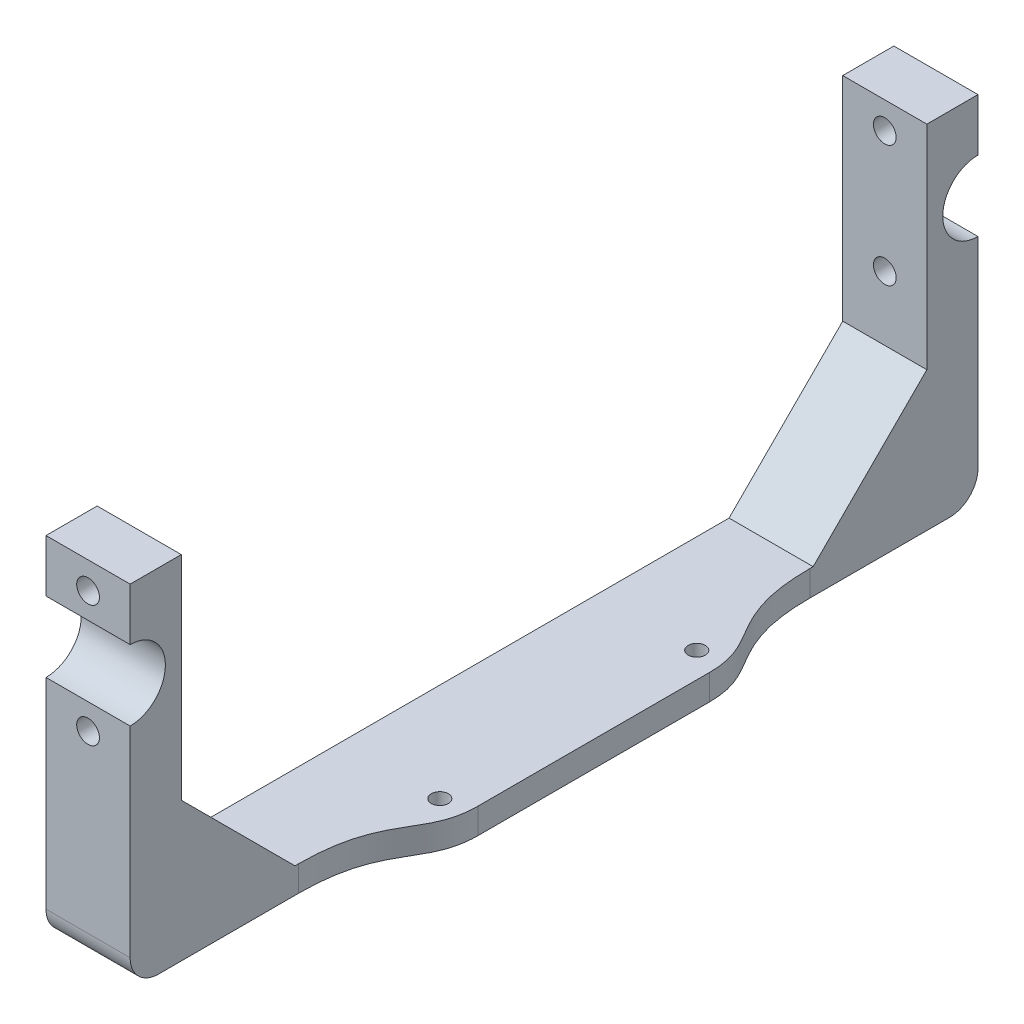
ISO-10303-21;
HEADER;
FILE_DESCRIPTION(('STEP AP214'),'2;1');
FILE_NAME('part.step','',(''),(''),'','','');
FILE_SCHEMA(('AUTOMOTIVE_DESIGN { 1 0 10303 214 1 1 1 1 }'));
ENDSEC;
DATA;
#1=APPLICATION_CONTEXT('core data for automotive mechanical design processes');
#2=APPLICATION_PROTOCOL_DEFINITION('international standard','automotive_design',2000,#1);
#3=PRODUCT_CONTEXT('',#1,'mechanical');
#4=PRODUCT('Part','Part','',(#3));
#5=PRODUCT_RELATED_PRODUCT_CATEGORY('part','',(#4));
#6=PRODUCT_DEFINITION_FORMATION('','',#4);
#7=PRODUCT_DEFINITION_CONTEXT('part definition',#1,'design');
#8=PRODUCT_DEFINITION('design','',#6,#7);
#9=PRODUCT_DEFINITION_SHAPE('','',#8);
#10=(LENGTH_UNIT() NAMED_UNIT(*) SI_UNIT(.MILLI.,.METRE.));
#11=(NAMED_UNIT(*) PLANE_ANGLE_UNIT() SI_UNIT($,.RADIAN.));
#12=(NAMED_UNIT(*) SI_UNIT($,.STERADIAN.) SOLID_ANGLE_UNIT());
#13=UNCERTAINTY_MEASURE_WITH_UNIT(LENGTH_MEASURE(1.E-05),#10,'distance_accuracy_value','');
#14=(GEOMETRIC_REPRESENTATION_CONTEXT(3) GLOBAL_UNCERTAINTY_ASSIGNED_CONTEXT((#13)) GLOBAL_UNIT_ASSIGNED_CONTEXT((#10,
#11,#12)) REPRESENTATION_CONTEXT('',''));
#15=CARTESIAN_POINT('',(0.,0.,0.));
#16=DIRECTION('',(0.,0.,1.));
#17=DIRECTION('',(1.,0.,0.));
#18=AXIS2_PLACEMENT_3D('',#15,#16,#17);
#19=CARTESIAN_POINT('',(14.8,4.5,90.));
#20=DIRECTION('',(0.,-1.,0.));
#21=DIRECTION('',(0.,0.,-1.));
#22=AXIS2_PLACEMENT_3D('',#19,#20,#21);
#23=PLANE('',#22);
#24=CARTESIAN_POINT('',(17.2994949366083,4.5,-22.6005050633851));
#25=DIRECTION('',(0.,-1.,0.));
#26=DIRECTION('',(0.,0.,-1.));
#27=AXIS2_PLACEMENT_3D('',#24,#25,#26);
#28=CIRCLE('',#27,1.50000000000194);
#29=CARTESIAN_POINT('',(17.2994949366083,4.5,-24.100505063387));
#30=VERTEX_POINT('',#29);
#31=EDGE_CURVE('E326',#30,#30,#28,.T.);
#32=ORIENTED_EDGE('',*,*,#31,.T.);
#33=EDGE_LOOP('',(#32));
#34=FACE_BOUND('',#33,.T.);
#35=CARTESIAN_POINT('',(17.2994949366089,4.5,22.6005050633857));
#36=DIRECTION('',(0.,-1.,0.));
#37=DIRECTION('',(0.,0.,-1.));
#38=AXIS2_PLACEMENT_3D('',#35,#36,#37);
#39=CIRCLE('',#38,1.50000000000153);
#40=CARTESIAN_POINT('',(17.2994949366089,4.5,21.1005050633841));
#41=VERTEX_POINT('',#40);
#42=EDGE_CURVE('E336',#41,#41,#39,.T.);
#43=ORIENTED_EDGE('',*,*,#42,.T.);
#44=EDGE_LOOP('',(#43));
#45=FACE_BOUND('',#44,.T.);
#46=DIRECTION('',(0.,0.,1.));
#47=VECTOR('',#46,1.);
#48=CARTESIAN_POINT('',(0.,4.5,90.));
#49=LINE('',#48,#47);
#50=CARTESIAN_POINT('',(0.,4.5,-45.579));
#51=VERTEX_POINT('',#50);
#52=CARTESIAN_POINT('',(0.,4.5,45.5789999999999));
#53=VERTEX_POINT('',#52);
#54=EDGE_CURVE('E350',#51,#53,#49,.T.);
#55=ORIENTED_EDGE('',*,*,#54,.T.);
#56=DIRECTION('',(1.,0.,0.));
#57=VECTOR('',#56,1.);
#58=CARTESIAN_POINT('',(14.8,4.5,45.5789999999999));
#59=LINE('',#58,#57);
#60=CARTESIAN_POINT('',(14.8,4.5,45.5789999999999));
#61=VERTEX_POINT('',#60);
#62=EDGE_CURVE('E370',#53,#61,#59,.T.);
#63=ORIENTED_EDGE('',*,*,#62,.T.);
#64=DIRECTION('',(0.,0.,1.));
#65=VECTOR('',#64,1.);
#66=CARTESIAN_POINT('',(14.8,4.5,90.));
#67=LINE('',#66,#65);
#68=CARTESIAN_POINT('',(14.8,4.5,45.));
#69=VERTEX_POINT('',#68);
#70=EDGE_CURVE('E358',#69,#61,#67,.T.);
#71=ORIENTED_EDGE('',*,*,#70,.F.);
#72=CARTESIAN_POINT('',(14.8,4.50000000000001,45.));
#73=CARTESIAN_POINT('',(14.8,4.50000000000001,29.7858355747064));
#74=CARTESIAN_POINT('',(21.8,4.50000000000001,29.7858355747064));
#75=CARTESIAN_POINT('',(21.8,4.50000000000001,20.3664277997835));
#76=B_SPLINE_CURVE_WITH_KNOTS('',3,(#72,#73,#74,#75),.UNSPECIFIED.,.F.,.F.,(4,4),(0.,1.),.UNSPECIFIED.);
#77=CARTESIAN_POINT('',(21.8,4.5,20.3664277997835));
#78=VERTEX_POINT('',#77);
#79=EDGE_CURVE('E313',#69,#78,#76,.T.);
#80=ORIENTED_EDGE('',*,*,#79,.T.);
#81=DIRECTION('',(0.,0.,1.));
#82=VECTOR('',#81,1.);
#83=CARTESIAN_POINT('',(21.8,4.5,45.));
#84=LINE('',#83,#82);
#85=CARTESIAN_POINT('',(21.8,4.5,-20.3664277997834));
#86=VERTEX_POINT('',#85);
#87=EDGE_CURVE('E343',#86,#78,#84,.T.);
#88=ORIENTED_EDGE('',*,*,#87,.F.);
#89=CARTESIAN_POINT('',(21.8,4.50000000000002,-20.3664277997835));
#90=CARTESIAN_POINT('',(21.8,4.50000000000002,-29.7858355747064));
#91=CARTESIAN_POINT('',(14.8,4.50000000000002,-29.7858355747064));
#92=CARTESIAN_POINT('',(14.8,4.50000000000002,-45.));
#93=B_SPLINE_CURVE_WITH_KNOTS('',3,(#89,#90,#91,#92),.UNSPECIFIED.,.F.,.F.,(4,4),(0.,1.),.UNSPECIFIED.);
#94=CARTESIAN_POINT('',(14.8,4.5,-45.));
#95=VERTEX_POINT('',#94);
#96=EDGE_CURVE('E316',#86,#95,#93,.T.);
#97=ORIENTED_EDGE('',*,*,#96,.T.);
#98=CARTESIAN_POINT('',(14.8,4.5,-45.579));
#99=VERTEX_POINT('',#98);
#100=EDGE_CURVE('E362',#99,#95,#67,.T.);
#101=ORIENTED_EDGE('',*,*,#100,.F.);
#102=DIRECTION('',(-1.,0.,0.));
#103=VECTOR('',#102,1.);
#104=CARTESIAN_POINT('',(14.8,4.5,-45.5790000000001));
#105=LINE('',#104,#103);
#106=EDGE_CURVE('E368',#99,#51,#105,.T.);
#107=ORIENTED_EDGE('',*,*,#106,.T.);
#108=EDGE_LOOP('',(#55,#63,#71,#80,#88,#97,#101,#107));
#109=FACE_BOUND('',#108,.T.);
#110=ADVANCED_FACE('F41',(#34,#45,#109),#23,.F.);
#111=CARTESIAN_POINT('',(14.8,0.,0.));
#112=DIRECTION('',(-1.,0.,0.));
#113=DIRECTION('',(0.,0.,1.));
#114=AXIS2_PLACEMENT_3D('',#111,#112,#113);
#115=PLANE('',#114);
#116=DIRECTION('',(0.,-1.,0.));
#117=VECTOR('',#116,1.);
#118=CARTESIAN_POINT('',(14.8,40.3,74.579));
#119=LINE('',#118,#117);
#120=CARTESIAN_POINT('',(14.8,40.3,74.579));
#121=VERTEX_POINT('',#120);
#122=CARTESIAN_POINT('',(14.8,5.,74.579));
#123=VERTEX_POINT('',#122);
#124=EDGE_CURVE('E185',#121,#123,#119,.T.);
#125=ORIENTED_EDGE('',*,*,#124,.T.);
#126=CARTESIAN_POINT('',(14.8,5.,69.579));
#127=DIRECTION('',(-1.,0.,0.));
#128=DIRECTION('',(0.,0.,1.));
#129=AXIS2_PLACEMENT_3D('',#126,#127,#128);
#130=CIRCLE('',#129,5.);
#131=CARTESIAN_POINT('',(14.8,0.,69.579));
#132=VERTEX_POINT('',#131);
#133=EDGE_CURVE('E426',#123,#132,#130,.F.);
#134=ORIENTED_EDGE('',*,*,#133,.T.);
#135=DIRECTION('',(0.,0.,1.));
#136=VECTOR('',#135,1.);
#137=CARTESIAN_POINT('',(14.8,0.,90.));
#138=LINE('',#137,#136);
#139=CARTESIAN_POINT('',(14.8,0.,45.));
#140=VERTEX_POINT('',#139);
#141=EDGE_CURVE('E347',#140,#132,#138,.T.);
#142=ORIENTED_EDGE('',*,*,#141,.F.);
#143=DIRECTION('',(0.,-1.,0.));
#144=VECTOR('',#143,1.);
#145=CARTESIAN_POINT('',(14.8,0.,45.));
#146=LINE('',#145,#144);
#147=EDGE_CURVE('E344',#69,#140,#146,.T.);
#148=ORIENTED_EDGE('',*,*,#147,.F.);
#149=ORIENTED_EDGE('',*,*,#70,.T.);
#150=DIRECTION('',(0.,0.707106781186544,0.707106781186551));
#151=VECTOR('',#150,1.);
#152=CARTESIAN_POINT('',(14.8,-20.5394999999999,20.5394999999997));
#153=LINE('',#152,#151);
#154=CARTESIAN_POINT('',(14.8,24.4999999999999,65.579));
#155=VERTEX_POINT('',#154);
#156=EDGE_CURVE('E377',#61,#155,#153,.T.);
#157=ORIENTED_EDGE('',*,*,#156,.T.);
#158=DIRECTION('',(0.,1.,0.));
#159=VECTOR('',#158,1.);
#160=CARTESIAN_POINT('',(14.8,46.5,65.579));
#161=LINE('',#160,#159);
#162=CARTESIAN_POINT('',(14.8,61.92,65.579));
#163=VERTEX_POINT('',#162);
#164=EDGE_CURVE('E221',#155,#163,#161,.T.);
#165=ORIENTED_EDGE('',*,*,#164,.T.);
#166=DIRECTION('',(0.,0.,1.));
#167=VECTOR('',#166,1.);
#168=CARTESIAN_POINT('',(14.8,61.92,74.579));
#169=LINE('',#168,#167);
#170=CARTESIAN_POINT('',(14.8,61.92,74.579));
#171=VERTEX_POINT('',#170);
#172=EDGE_CURVE('E207',#163,#171,#169,.T.);
#173=ORIENTED_EDGE('',*,*,#172,.T.);
#174=DIRECTION('',(0.,-1.,0.));
#175=VECTOR('',#174,1.);
#176=CARTESIAN_POINT('',(14.8,52.7,74.579));
#177=LINE('',#176,#175);
#178=CARTESIAN_POINT('',(14.8,52.7,74.579));
#179=VERTEX_POINT('',#178);
#180=EDGE_CURVE('E204',#171,#179,#177,.T.);
#181=ORIENTED_EDGE('',*,*,#180,.T.);
#182=CARTESIAN_POINT('',(14.8,46.5,74.579));
#183=DIRECTION('',(-1.,0.,0.));
#184=DIRECTION('',(0.,0.,1.));
#185=AXIS2_PLACEMENT_3D('',#182,#183,#184);
#186=CIRCLE('',#185,6.19999999999999);
#187=EDGE_CURVE('E218',#179,#121,#186,.T.);
#188=ORIENTED_EDGE('',*,*,#187,.T.);
#189=EDGE_LOOP('',(#125,#134,#142,#148,#149,#157,#165,#173,#181,#188));
#190=FACE_BOUND('',#189,.T.);
#191=ADVANCED_FACE('F458',(#190),#115,.F.);
#192=CARTESIAN_POINT('',(14.8,0.,-69.5789999999999));
#193=VERTEX_POINT('',#192);
#194=CARTESIAN_POINT('',(14.8,0.,-45.));
#195=VERTEX_POINT('',#194);
#196=EDGE_CURVE('E351',#193,#195,#138,.T.);
#197=ORIENTED_EDGE('',*,*,#196,.F.);
#198=CARTESIAN_POINT('',(14.8,5.00000000000003,-69.579));
#199=DIRECTION('',(-1.,0.,0.));
#200=DIRECTION('',(0.,0.,1.));
#201=AXIS2_PLACEMENT_3D('',#198,#199,#200);
#202=CIRCLE('',#201,5.);
#203=CARTESIAN_POINT('',(14.8,5.00000000000005,-74.579));
#204=VERTEX_POINT('',#203);
#205=EDGE_CURVE('E427',#193,#204,#202,.F.);
#206=ORIENTED_EDGE('',*,*,#205,.T.);
#207=DIRECTION('',(0.,1.,0.));
#208=VECTOR('',#207,1.);
#209=CARTESIAN_POINT('',(14.8,40.3,-74.579));
#210=LINE('',#209,#208);
#211=CARTESIAN_POINT('',(14.8,40.3,-74.579));
#212=VERTEX_POINT('',#211);
#213=EDGE_CURVE('E226',#204,#212,#210,.T.);
#214=ORIENTED_EDGE('',*,*,#213,.T.);
#215=CARTESIAN_POINT('',(14.8,46.5,-74.579));
#216=DIRECTION('',(-1.,0.,0.));
#217=DIRECTION('',(0.,0.,-1.));
#218=AXIS2_PLACEMENT_3D('',#215,#216,#217);
#219=CIRCLE('',#218,6.19999999999999);
#220=CARTESIAN_POINT('',(14.8,52.7,-74.579));
#221=VERTEX_POINT('',#220);
#222=EDGE_CURVE('E247',#212,#221,#219,.T.);
#223=ORIENTED_EDGE('',*,*,#222,.T.);
#224=DIRECTION('',(0.,1.,0.));
#225=VECTOR('',#224,1.);
#226=CARTESIAN_POINT('',(14.8,52.7,-74.579));
#227=LINE('',#226,#225);
#228=CARTESIAN_POINT('',(14.8,61.92,-74.579));
#229=VERTEX_POINT('',#228);
#230=EDGE_CURVE('E250',#221,#229,#227,.T.);
#231=ORIENTED_EDGE('',*,*,#230,.T.);
#232=DIRECTION('',(0.,0.,1.));
#233=VECTOR('',#232,1.);
#234=CARTESIAN_POINT('',(14.8,61.92,-74.579));
#235=LINE('',#234,#233);
#236=CARTESIAN_POINT('',(14.8,61.92,-65.579));
#237=VERTEX_POINT('',#236);
#238=EDGE_CURVE('E253',#229,#237,#235,.T.);
#239=ORIENTED_EDGE('',*,*,#238,.T.);
#240=DIRECTION('',(0.,-1.,0.));
#241=VECTOR('',#240,1.);
#242=CARTESIAN_POINT('',(14.8,46.5,-65.579));
#243=LINE('',#242,#241);
#244=CARTESIAN_POINT('',(14.8,24.5000000000001,-65.579));
#245=VERTEX_POINT('',#244);
#246=EDGE_CURVE('E234',#237,#245,#243,.T.);
#247=ORIENTED_EDGE('',*,*,#246,.T.);
#248=DIRECTION('',(0.,-0.707106781186551,0.707106781186544));
#249=VECTOR('',#248,1.);
#250=CARTESIAN_POINT('',(14.8,-20.5395000000001,-20.5395000000003));
#251=LINE('',#250,#249);
#252=EDGE_CURVE('E50',#245,#99,#251,.T.);
#253=ORIENTED_EDGE('',*,*,#252,.T.);
#254=ORIENTED_EDGE('',*,*,#100,.T.);
#255=DIRECTION('',(0.,1.,0.));
#256=VECTOR('',#255,1.);
#257=CARTESIAN_POINT('',(14.8,0.,-45.));
#258=LINE('',#257,#256);
#259=EDGE_CURVE('E339',#195,#95,#258,.T.);
#260=ORIENTED_EDGE('',*,*,#259,.F.);
#261=EDGE_LOOP('',(#197,#206,#214,#223,#231,#239,#247,#253,#254,#260));
#262=FACE_BOUND('',#261,.T.);
#263=ADVANCED_FACE('F383',(#262),#115,.F.);
#264=CARTESIAN_POINT('',(0.,0.,0.));
#265=DIRECTION('',(-1.,0.,0.));
#266=DIRECTION('',(0.,0.,1.));
#267=AXIS2_PLACEMENT_3D('',#264,#265,#266);
#268=PLANE('',#267);
#269=DIRECTION('',(0.,0.,1.));
#270=VECTOR('',#269,1.);
#271=CARTESIAN_POINT('',(0.,0.,90.));
#272=LINE('',#271,#270);
#273=CARTESIAN_POINT('',(0.,0.,-69.5789999999999));
#274=VERTEX_POINT('',#273);
#275=CARTESIAN_POINT('',(0.,0.,69.579));
#276=VERTEX_POINT('',#275);
#277=EDGE_CURVE('E348',#274,#276,#272,.T.);
#278=ORIENTED_EDGE('',*,*,#277,.T.);
#279=CARTESIAN_POINT('',(0.,5.,69.579));
#280=DIRECTION('',(-1.,0.,0.));
#281=DIRECTION('',(0.,0.,1.));
#282=AXIS2_PLACEMENT_3D('',#279,#280,#281);
#283=CIRCLE('',#282,5.);
#284=CARTESIAN_POINT('',(0.,5.,74.579));
#285=VERTEX_POINT('',#284);
#286=EDGE_CURVE('E199',#276,#285,#283,.T.);
#287=ORIENTED_EDGE('',*,*,#286,.T.);
#288=DIRECTION('',(0.,-1.,0.));
#289=VECTOR('',#288,1.);
#290=CARTESIAN_POINT('',(0.,40.3,74.579));
#291=LINE('',#290,#289);
#292=CARTESIAN_POINT('',(0.,40.3,74.579));
#293=VERTEX_POINT('',#292);
#294=EDGE_CURVE('E182',#293,#285,#291,.T.);
#295=ORIENTED_EDGE('',*,*,#294,.F.);
#296=CARTESIAN_POINT('',(0.,46.5,74.579));
#297=DIRECTION('',(-1.,0.,0.));
#298=DIRECTION('',(0.,0.,1.));
#299=AXIS2_PLACEMENT_3D('',#296,#297,#298);
#300=CIRCLE('',#299,6.19999999999999);
#301=CARTESIAN_POINT('',(0.,52.7,74.579));
#302=VERTEX_POINT('',#301);
#303=EDGE_CURVE('E197',#302,#293,#300,.T.);
#304=ORIENTED_EDGE('',*,*,#303,.F.);
#305=DIRECTION('',(0.,-1.,0.));
#306=VECTOR('',#305,1.);
#307=CARTESIAN_POINT('',(0.,52.7,74.579));
#308=LINE('',#307,#306);
#309=CARTESIAN_POINT('',(0.,61.92,74.579));
#310=VERTEX_POINT('',#309);
#311=EDGE_CURVE('E191',#310,#302,#308,.T.);
#312=ORIENTED_EDGE('',*,*,#311,.F.);
#313=DIRECTION('',(0.,0.,1.));
#314=VECTOR('',#313,1.);
#315=CARTESIAN_POINT('',(0.,61.92,74.579));
#316=LINE('',#315,#314);
#317=CARTESIAN_POINT('',(0.,61.92,65.579));
#318=VERTEX_POINT('',#317);
#319=EDGE_CURVE('E214',#318,#310,#316,.T.);
#320=ORIENTED_EDGE('',*,*,#319,.F.);
#321=DIRECTION('',(0.,1.,0.));
#322=VECTOR('',#321,1.);
#323=CARTESIAN_POINT('',(0.,46.5,65.579));
#324=LINE('',#323,#322);
#325=CARTESIAN_POINT('',(0.,24.4999999999999,65.579));
#326=VERTEX_POINT('',#325);
#327=EDGE_CURVE('E200',#326,#318,#324,.T.);
#328=ORIENTED_EDGE('',*,*,#327,.F.);
#329=DIRECTION('',(0.,-0.707106781186544,-0.707106781186551));
#330=VECTOR('',#329,1.);
#331=CARTESIAN_POINT('',(0.,4.5,45.5789999999999));
#332=LINE('',#331,#330);
#333=EDGE_CURVE('E379',#326,#53,#332,.T.);
#334=ORIENTED_EDGE('',*,*,#333,.T.);
#335=ORIENTED_EDGE('',*,*,#54,.F.);
#336=DIRECTION('',(0.,0.707106781186551,-0.707106781186544));
#337=VECTOR('',#336,1.);
#338=CARTESIAN_POINT('',(0.,24.5000000000001,-65.579));
#339=LINE('',#338,#337);
#340=CARTESIAN_POINT('',(0.,24.5000000000001,-65.579));
#341=VERTEX_POINT('',#340);
#342=EDGE_CURVE('E11',#51,#341,#339,.T.);
#343=ORIENTED_EDGE('',*,*,#342,.T.);
#344=DIRECTION('',(0.,-1.,0.));
#345=VECTOR('',#344,1.);
#346=CARTESIAN_POINT('',(0.,46.5,-65.579));
#347=LINE('',#346,#345);
#348=CARTESIAN_POINT('',(0.,61.92,-65.579));
#349=VERTEX_POINT('',#348);
#350=EDGE_CURVE('E243',#349,#341,#347,.T.);
#351=ORIENTED_EDGE('',*,*,#350,.F.);
#352=DIRECTION('',(0.,0.,1.));
#353=VECTOR('',#352,1.);
#354=CARTESIAN_POINT('',(0.,61.92,-74.579));
#355=LINE('',#354,#353);
#356=CARTESIAN_POINT('',(0.,61.92,-74.579));
#357=VERTEX_POINT('',#356);
#358=EDGE_CURVE('E240',#357,#349,#355,.T.);
#359=ORIENTED_EDGE('',*,*,#358,.F.);
#360=DIRECTION('',(0.,1.,0.));
#361=VECTOR('',#360,1.);
#362=CARTESIAN_POINT('',(0.,52.7,-74.579));
#363=LINE('',#362,#361);
#364=CARTESIAN_POINT('',(0.,52.7,-74.579));
#365=VERTEX_POINT('',#364);
#366=EDGE_CURVE('E237',#365,#357,#363,.T.);
#367=ORIENTED_EDGE('',*,*,#366,.F.);
#368=CARTESIAN_POINT('',(0.,46.5,-74.579));
#369=DIRECTION('',(-1.,0.,0.));
#370=DIRECTION('',(0.,0.,-1.));
#371=AXIS2_PLACEMENT_3D('',#368,#369,#370);
#372=CIRCLE('',#371,6.19999999999999);
#373=CARTESIAN_POINT('',(0.,40.3,-74.579));
#374=VERTEX_POINT('',#373);
#375=EDGE_CURVE('E233',#374,#365,#372,.T.);
#376=ORIENTED_EDGE('',*,*,#375,.F.);
#377=DIRECTION('',(0.,1.,0.));
#378=VECTOR('',#377,1.);
#379=CARTESIAN_POINT('',(0.,40.3,-74.579));
#380=LINE('',#379,#378);
#381=CARTESIAN_POINT('',(0.,5.00000000000005,-74.579));
#382=VERTEX_POINT('',#381);
#383=EDGE_CURVE('E231',#382,#374,#380,.T.);
#384=ORIENTED_EDGE('',*,*,#383,.F.);
#385=CARTESIAN_POINT('',(0.,5.00000000000003,-69.579));
#386=DIRECTION('',(-1.,0.,0.));
#387=DIRECTION('',(0.,0.,1.));
#388=AXIS2_PLACEMENT_3D('',#385,#386,#387);
#389=CIRCLE('',#388,5.);
#390=EDGE_CURVE('E410',#382,#274,#389,.T.);
#391=ORIENTED_EDGE('',*,*,#390,.T.);
#392=EDGE_LOOP('',(#278,#287,#295,#304,#312,#320,#328,#334,#335,#343,#351,#359,#367,#376,#384,#391));
#393=FACE_BOUND('',#392,.T.);
#394=ADVANCED_FACE('F195',(#393),#268,.T.);
#395=CARTESIAN_POINT('',(0.,0.,90.));
#396=DIRECTION('',(0.,1.,0.));
#397=DIRECTION('',(0.,0.,1.));
#398=AXIS2_PLACEMENT_3D('',#395,#396,#397);
#399=PLANE('',#398);
#400=CARTESIAN_POINT('',(17.2994949366089,0.,22.6005050633857));
#401=DIRECTION('',(0.,-1.,0.));
#402=DIRECTION('',(0.,0.,1.));
#403=AXIS2_PLACEMENT_3D('',#400,#401,#402);
#404=CIRCLE('',#403,1.50000000000153);
#405=CARTESIAN_POINT('',(17.2994949366089,0.,24.1005050633872));
#406=VERTEX_POINT('',#405);
#407=EDGE_CURVE('E261',#406,#406,#404,.T.);
#408=ORIENTED_EDGE('',*,*,#407,.F.);
#409=EDGE_LOOP('',(#408));
#410=FACE_BOUND('',#409,.T.);
#411=CARTESIAN_POINT('',(17.2994949366083,0.,-22.6005050633851));
#412=DIRECTION('',(0.,-1.,0.));
#413=DIRECTION('',(0.,0.,-1.));
#414=AXIS2_PLACEMENT_3D('',#411,#412,#413);
#415=CIRCLE('',#414,1.50000000000194);
#416=CARTESIAN_POINT('',(17.2994949366083,0.,-24.100505063387));
#417=VERTEX_POINT('',#416);
#418=EDGE_CURVE('E307',#417,#417,#415,.T.);
#419=ORIENTED_EDGE('',*,*,#418,.F.);
#420=EDGE_LOOP('',(#419));
#421=FACE_BOUND('',#420,.T.);
#422=ORIENTED_EDGE('',*,*,#141,.T.);
#423=DIRECTION('',(-1.,0.,0.));
#424=VECTOR('',#423,1.);
#425=CARTESIAN_POINT('',(0.,0.,69.579));
#426=LINE('',#425,#424);
#427=EDGE_CURVE('E417',#132,#276,#426,.T.);
#428=ORIENTED_EDGE('',*,*,#427,.T.);
#429=ORIENTED_EDGE('',*,*,#277,.F.);
#430=DIRECTION('',(1.,0.,0.));
#431=VECTOR('',#430,1.);
#432=CARTESIAN_POINT('',(14.8,0.,-69.579));
#433=LINE('',#432,#431);
#434=EDGE_CURVE('E416',#274,#193,#433,.T.);
#435=ORIENTED_EDGE('',*,*,#434,.T.);
#436=ORIENTED_EDGE('',*,*,#196,.T.);
#437=CARTESIAN_POINT('',(21.8,0.,-20.3664277997835));
#438=CARTESIAN_POINT('',(21.8,0.,-29.7858355747064));
#439=CARTESIAN_POINT('',(14.8,0.,-29.7858355747064));
#440=CARTESIAN_POINT('',(14.8,0.,-45.));
#441=B_SPLINE_CURVE_WITH_KNOTS('',3,(#437,#438,#439,#440),.UNSPECIFIED.,.F.,.F.,(4,4),(0.,1.),.UNSPECIFIED.);
#442=CARTESIAN_POINT('',(21.8,0.,-20.3664277997835));
#443=VERTEX_POINT('',#442);
#444=EDGE_CURVE('E275',#443,#195,#441,.T.);
#445=ORIENTED_EDGE('',*,*,#444,.F.);
#446=DIRECTION('',(0.,0.,-1.));
#447=VECTOR('',#446,1.);
#448=CARTESIAN_POINT('',(21.8,0.,-45.));
#449=LINE('',#448,#447);
#450=CARTESIAN_POINT('',(21.8,0.,20.3664277997834));
#451=VERTEX_POINT('',#450);
#452=EDGE_CURVE('E340',#451,#443,#449,.T.);
#453=ORIENTED_EDGE('',*,*,#452,.F.);
#454=CARTESIAN_POINT('',(14.8,0.,45.));
#455=CARTESIAN_POINT('',(14.8,0.,29.7858355747064));
#456=CARTESIAN_POINT('',(21.8,0.,29.7858355747064));
#457=CARTESIAN_POINT('',(21.8,0.,20.3664277997835));
#458=B_SPLINE_CURVE_WITH_KNOTS('',3,(#454,#455,#456,#457),.UNSPECIFIED.,.F.,.F.,(4,4),(0.,1.),.UNSPECIFIED.);
#459=EDGE_CURVE('E270',#140,#451,#458,.T.);
#460=ORIENTED_EDGE('',*,*,#459,.F.);
#461=EDGE_LOOP('',(#422,#428,#429,#435,#436,#445,#453,#460));
#462=FACE_BOUND('',#461,.T.);
#463=ADVANCED_FACE('F430',(#410,#421,#462),#399,.F.);
#464=CARTESIAN_POINT('',(21.8,0.,0.));
#465=DIRECTION('',(-1.,0.,0.));
#466=DIRECTION('',(0.,0.,1.));
#467=AXIS2_PLACEMENT_3D('',#464,#465,#466);
#468=PLANE('',#467);
#469=ORIENTED_EDGE('',*,*,#452,.T.);
#470=DIRECTION('',(0.,1.,0.));
#471=VECTOR('',#470,1.);
#472=CARTESIAN_POINT('',(21.8,0.,-20.3664277997835));
#473=LINE('',#472,#471);
#474=EDGE_CURVE('E433',#443,#86,#473,.T.);
#475=ORIENTED_EDGE('',*,*,#474,.T.);
#476=ORIENTED_EDGE('',*,*,#87,.T.);
#477=DIRECTION('',(0.,-1.,0.));
#478=VECTOR('',#477,1.);
#479=CARTESIAN_POINT('',(21.8,8.,20.3664277997835));
#480=LINE('',#479,#478);
#481=EDGE_CURVE('E365',#78,#451,#480,.T.);
#482=ORIENTED_EDGE('',*,*,#481,.T.);
#483=EDGE_LOOP('',(#469,#475,#476,#482));
#484=FACE_BOUND('',#483,.T.);
#485=ADVANCED_FACE('F294',(#484),#468,.F.);
#486=CARTESIAN_POINT('',(14.8,7.99999999999999,45.));
#487=CARTESIAN_POINT('',(14.8,7.99999999999999,29.7858355747064));
#488=CARTESIAN_POINT('',(21.8,7.99999999999999,29.7858355747064));
#489=CARTESIAN_POINT('',(21.8,8.,20.3664277997835));
#490=B_SPLINE_CURVE_WITH_KNOTS('',3,(#486,#487,#488,#489),.UNSPECIFIED.,.F.,.F.,(4,4),(0.,1.),.UNSPECIFIED.);
#491=DIRECTION('',(0.,-1.,0.));
#492=VECTOR('',#491,1.);
#493=SURFACE_OF_LINEAR_EXTRUSION('',#490,#492);
#494=ORIENTED_EDGE('',*,*,#147,.T.);
#495=ORIENTED_EDGE('',*,*,#459,.T.);
#496=ORIENTED_EDGE('',*,*,#481,.F.);
#497=ORIENTED_EDGE('',*,*,#79,.F.);
#498=EDGE_LOOP('',(#494,#495,#496,#497));
#499=FACE_BOUND('',#498,.T.);
#500=ADVANCED_FACE('F288',(#499),#493,.F.);
#501=CARTESIAN_POINT('',(21.8,8.,-20.3664277997835));
#502=CARTESIAN_POINT('',(21.8,8.00000000000001,-29.7858355747064));
#503=CARTESIAN_POINT('',(14.8,8.00000000000001,-29.7858355747064));
#504=CARTESIAN_POINT('',(14.8,8.00000000000001,-45.));
#505=B_SPLINE_CURVE_WITH_KNOTS('',3,(#501,#502,#503,#504),.UNSPECIFIED.,.F.,.F.,(4,4),(0.,1.),.UNSPECIFIED.);
#506=DIRECTION('',(0.,-1.,0.));
#507=VECTOR('',#506,1.);
#508=SURFACE_OF_LINEAR_EXTRUSION('',#505,#507);
#509=ORIENTED_EDGE('',*,*,#474,.F.);
#510=ORIENTED_EDGE('',*,*,#444,.T.);
#511=ORIENTED_EDGE('',*,*,#259,.T.);
#512=ORIENTED_EDGE('',*,*,#96,.F.);
#513=EDGE_LOOP('',(#509,#510,#511,#512));
#514=FACE_BOUND('',#513,.T.);
#515=ADVANCED_FACE('F283',(#514),#508,.F.);
#516=CARTESIAN_POINT('',(17.2994949366083,8.,-22.6005050633851));
#517=DIRECTION('',(0.,-1.,0.));
#518=DIRECTION('',(0.,0.,-1.));
#519=AXIS2_PLACEMENT_3D('',#516,#517,#518);
#520=CYLINDRICAL_SURFACE('',#519,1.50000000000194);
#521=ORIENTED_EDGE('',*,*,#418,.T.);
#522=EDGE_LOOP('',(#521));
#523=FACE_BOUND('',#522,.T.);
#524=ORIENTED_EDGE('',*,*,#31,.F.);
#525=EDGE_LOOP('',(#524));
#526=FACE_BOUND('',#525,.T.);
#527=ADVANCED_FACE('F287',(#523,#526),#520,.F.);
#528=CARTESIAN_POINT('',(17.2994949366089,8.,22.6005050633857));
#529=DIRECTION('',(0.,-1.,0.));
#530=DIRECTION('',(0.,0.,-1.));
#531=AXIS2_PLACEMENT_3D('',#528,#529,#530);
#532=CYLINDRICAL_SURFACE('',#531,1.50000000000153);
#533=ORIENTED_EDGE('',*,*,#407,.T.);
#534=EDGE_LOOP('',(#533));
#535=FACE_BOUND('',#534,.T.);
#536=ORIENTED_EDGE('',*,*,#42,.F.);
#537=EDGE_LOOP('',(#536));
#538=FACE_BOUND('',#537,.T.);
#539=ADVANCED_FACE('F290',(#535,#538),#532,.F.);
#540=CARTESIAN_POINT('',(0.,46.5,-65.579));
#541=DIRECTION('',(0.,0.,1.));
#542=DIRECTION('',(0.,-1.,0.));
#543=AXIS2_PLACEMENT_3D('',#540,#541,#542);
#544=PLANE('',#543);
#545=CARTESIAN_POINT('',(7.4,57.2,-65.579));
#546=DIRECTION('',(0.,0.,1.));
#547=DIRECTION('',(0.,-1.,0.));
#548=AXIS2_PLACEMENT_3D('',#545,#546,#547);
#549=CIRCLE('',#548,2.);
#550=CARTESIAN_POINT('',(7.4,55.2,-65.579));
#551=VERTEX_POINT('',#550);
#552=EDGE_CURVE('E210',#551,#551,#549,.T.);
#553=ORIENTED_EDGE('',*,*,#552,.F.);
#554=EDGE_LOOP('',(#553));
#555=FACE_BOUND('',#554,.T.);
#556=CARTESIAN_POINT('',(7.4,35.8,-65.579));
#557=DIRECTION('',(0.,0.,1.));
#558=DIRECTION('',(0.,-1.,0.));
#559=AXIS2_PLACEMENT_3D('',#556,#557,#558);
#560=CIRCLE('',#559,2.);
#561=CARTESIAN_POINT('',(7.4,33.8,-65.579));
#562=VERTEX_POINT('',#561);
#563=EDGE_CURVE('E441',#562,#562,#560,.T.);
#564=ORIENTED_EDGE('',*,*,#563,.F.);
#565=EDGE_LOOP('',(#564));
#566=FACE_BOUND('',#565,.T.);
#567=ORIENTED_EDGE('',*,*,#350,.T.);
#568=DIRECTION('',(1.,0.,0.));
#569=VECTOR('',#568,1.);
#570=CARTESIAN_POINT('',(0.,24.5000000000001,-65.579));
#571=LINE('',#570,#569);
#572=EDGE_CURVE('E375',#341,#245,#571,.T.);
#573=ORIENTED_EDGE('',*,*,#572,.T.);
#574=ORIENTED_EDGE('',*,*,#246,.F.);
#575=DIRECTION('',(1.,0.,0.));
#576=VECTOR('',#575,1.);
#577=CARTESIAN_POINT('',(0.,61.92,-65.579));
#578=LINE('',#577,#576);
#579=EDGE_CURVE('E258',#349,#237,#578,.T.);
#580=ORIENTED_EDGE('',*,*,#579,.F.);
#581=EDGE_LOOP('',(#567,#573,#574,#580));
#582=FACE_BOUND('',#581,.T.);
#583=ADVANCED_FACE('F390',(#555,#566,#582),#544,.T.);
#584=CARTESIAN_POINT('',(0.,61.92,-74.579));
#585=DIRECTION('',(0.,1.,0.));
#586=DIRECTION('',(0.,0.,1.));
#587=AXIS2_PLACEMENT_3D('',#584,#585,#586);
#588=PLANE('',#587);
#589=ORIENTED_EDGE('',*,*,#238,.F.);
#590=DIRECTION('',(1.,0.,0.));
#591=VECTOR('',#590,1.);
#592=CARTESIAN_POINT('',(0.,61.92,-74.579));
#593=LINE('',#592,#591);
#594=EDGE_CURVE('E262',#357,#229,#593,.T.);
#595=ORIENTED_EDGE('',*,*,#594,.F.);
#596=ORIENTED_EDGE('',*,*,#358,.T.);
#597=ORIENTED_EDGE('',*,*,#579,.T.);
#598=EDGE_LOOP('',(#589,#595,#596,#597));
#599=FACE_BOUND('',#598,.T.);
#600=ADVANCED_FACE('F395',(#599),#588,.T.);
#601=CARTESIAN_POINT('',(0.,52.7,-74.579));
#602=DIRECTION('',(0.,0.,-1.));
#603=DIRECTION('',(-1.,0.,0.));
#604=AXIS2_PLACEMENT_3D('',#601,#602,#603);
#605=PLANE('',#604);
#606=CARTESIAN_POINT('',(7.4,57.2,-74.579));
#607=DIRECTION('',(0.,0.,-1.));
#608=DIRECTION('',(-1.,0.,0.));
#609=AXIS2_PLACEMENT_3D('',#606,#607,#608);
#610=CIRCLE('',#609,2.);
#611=CARTESIAN_POINT('',(5.4,57.2,-74.579));
#612=VERTEX_POINT('',#611);
#613=EDGE_CURVE('E537',#612,#612,#610,.T.);
#614=ORIENTED_EDGE('',*,*,#613,.F.);
#615=EDGE_LOOP('',(#614));
#616=FACE_BOUND('',#615,.T.);
#617=ORIENTED_EDGE('',*,*,#230,.F.);
#618=DIRECTION('',(1.,0.,0.));
#619=VECTOR('',#618,1.);
#620=CARTESIAN_POINT('',(0.,52.7,-74.579));
#621=LINE('',#620,#619);
#622=EDGE_CURVE('E264',#365,#221,#621,.T.);
#623=ORIENTED_EDGE('',*,*,#622,.F.);
#624=ORIENTED_EDGE('',*,*,#366,.T.);
#625=ORIENTED_EDGE('',*,*,#594,.T.);
#626=EDGE_LOOP('',(#617,#623,#624,#625));
#627=FACE_BOUND('',#626,.T.);
#628=ADVANCED_FACE('F398',(#616,#627),#605,.T.);
#629=CARTESIAN_POINT('',(0.,46.5,-74.579));
#630=DIRECTION('',(1.,0.,0.));
#631=DIRECTION('',(0.,0.,-1.));
#632=AXIS2_PLACEMENT_3D('',#629,#630,#631);
#633=CYLINDRICAL_SURFACE('',#632,6.19999999999999);
#634=ORIENTED_EDGE('',*,*,#222,.F.);
#635=DIRECTION('',(1.,0.,0.));
#636=VECTOR('',#635,1.);
#637=CARTESIAN_POINT('',(0.,40.3,-74.579));
#638=LINE('',#637,#636);
#639=EDGE_CURVE('E245',#374,#212,#638,.T.);
#640=ORIENTED_EDGE('',*,*,#639,.F.);
#641=ORIENTED_EDGE('',*,*,#375,.T.);
#642=ORIENTED_EDGE('',*,*,#622,.T.);
#643=EDGE_LOOP('',(#634,#640,#641,#642));
#644=FACE_BOUND('',#643,.T.);
#645=ADVANCED_FACE('F404',(#644),#633,.F.);
#646=CARTESIAN_POINT('',(0.,40.3,-74.579));
#647=DIRECTION('',(0.,0.,-1.));
#648=DIRECTION('',(-1.,0.,0.));
#649=AXIS2_PLACEMENT_3D('',#646,#647,#648);
#650=PLANE('',#649);
#651=CARTESIAN_POINT('',(7.4,35.8,-74.579));
#652=DIRECTION('',(0.,0.,-1.));
#653=DIRECTION('',(-1.,0.,0.));
#654=AXIS2_PLACEMENT_3D('',#651,#652,#653);
#655=CIRCLE('',#654,2.);
#656=CARTESIAN_POINT('',(5.4,35.8,-74.579));
#657=VERTEX_POINT('',#656);
#658=EDGE_CURVE('E530',#657,#657,#655,.T.);
#659=ORIENTED_EDGE('',*,*,#658,.F.);
#660=EDGE_LOOP('',(#659));
#661=FACE_BOUND('',#660,.T.);
#662=ORIENTED_EDGE('',*,*,#213,.F.);
#663=DIRECTION('',(1.,0.,0.));
#664=VECTOR('',#663,1.);
#665=CARTESIAN_POINT('',(0.,5.00000000000003,-74.579));
#666=LINE('',#665,#664);
#667=EDGE_CURVE('E366',#204,#382,#666,.F.);
#668=ORIENTED_EDGE('',*,*,#667,.T.);
#669=ORIENTED_EDGE('',*,*,#383,.T.);
#670=ORIENTED_EDGE('',*,*,#639,.T.);
#671=EDGE_LOOP('',(#662,#668,#669,#670));
#672=FACE_BOUND('',#671,.T.);
#673=ADVANCED_FACE('F407',(#661,#672),#650,.T.);
#674=CARTESIAN_POINT('',(0.,46.5,74.579));
#675=DIRECTION('',(1.,0.,0.));
#676=DIRECTION('',(0.,0.,-1.));
#677=AXIS2_PLACEMENT_3D('',#674,#675,#676);
#678=CYLINDRICAL_SURFACE('',#677,6.19999999999999);
#679=ORIENTED_EDGE('',*,*,#187,.F.);
#680=DIRECTION('',(1.,0.,0.));
#681=VECTOR('',#680,1.);
#682=CARTESIAN_POINT('',(0.,52.7,74.579));
#683=LINE('',#682,#681);
#684=EDGE_CURVE('E203',#302,#179,#683,.T.);
#685=ORIENTED_EDGE('',*,*,#684,.F.);
#686=ORIENTED_EDGE('',*,*,#303,.T.);
#687=DIRECTION('',(1.,0.,0.));
#688=VECTOR('',#687,1.);
#689=CARTESIAN_POINT('',(0.,40.3,74.579));
#690=LINE('',#689,#688);
#691=EDGE_CURVE('E179',#293,#121,#690,.T.);
#692=ORIENTED_EDGE('',*,*,#691,.T.);
#693=EDGE_LOOP('',(#679,#685,#686,#692));
#694=FACE_BOUND('',#693,.T.);
#695=ADVANCED_FACE('F202',(#694),#678,.F.);
#696=CARTESIAN_POINT('',(0.,52.7,74.579));
#697=DIRECTION('',(0.,0.,1.));
#698=DIRECTION('',(1.,0.,0.));
#699=AXIS2_PLACEMENT_3D('',#696,#697,#698);
#700=PLANE('',#699);
#701=CARTESIAN_POINT('',(7.4,57.2,74.579));
#702=DIRECTION('',(0.,0.,1.));
#703=DIRECTION('',(1.,0.,0.));
#704=AXIS2_PLACEMENT_3D('',#701,#702,#703);
#705=CIRCLE('',#704,2.);
#706=CARTESIAN_POINT('',(9.4,57.2,74.579));
#707=VERTEX_POINT('',#706);
#708=EDGE_CURVE('E440',#707,#707,#705,.T.);
#709=ORIENTED_EDGE('',*,*,#708,.F.);
#710=EDGE_LOOP('',(#709));
#711=FACE_BOUND('',#710,.T.);
#712=ORIENTED_EDGE('',*,*,#180,.F.);
#713=DIRECTION('',(1.,0.,0.));
#714=VECTOR('',#713,1.);
#715=CARTESIAN_POINT('',(0.,61.92,74.579));
#716=LINE('',#715,#714);
#717=EDGE_CURVE('E227',#310,#171,#716,.T.);
#718=ORIENTED_EDGE('',*,*,#717,.F.);
#719=ORIENTED_EDGE('',*,*,#311,.T.);
#720=ORIENTED_EDGE('',*,*,#684,.T.);
#721=EDGE_LOOP('',(#712,#718,#719,#720));
#722=FACE_BOUND('',#721,.T.);
#723=ADVANCED_FACE('F466',(#711,#722),#700,.T.);
#724=CARTESIAN_POINT('',(0.,61.92,74.579));
#725=DIRECTION('',(0.,1.,0.));
#726=DIRECTION('',(0.,0.,1.));
#727=AXIS2_PLACEMENT_3D('',#724,#725,#726);
#728=PLANE('',#727);
#729=ORIENTED_EDGE('',*,*,#172,.F.);
#730=DIRECTION('',(1.,0.,0.));
#731=VECTOR('',#730,1.);
#732=CARTESIAN_POINT('',(0.,61.92,65.579));
#733=LINE('',#732,#731);
#734=EDGE_CURVE('E190',#318,#163,#733,.T.);
#735=ORIENTED_EDGE('',*,*,#734,.F.);
#736=ORIENTED_EDGE('',*,*,#319,.T.);
#737=ORIENTED_EDGE('',*,*,#717,.T.);
#738=EDGE_LOOP('',(#729,#735,#736,#737));
#739=FACE_BOUND('',#738,.T.);
#740=ADVANCED_FACE('F472',(#739),#728,.T.);
#741=CARTESIAN_POINT('',(0.,46.5,65.579));
#742=DIRECTION('',(0.,0.,-1.));
#743=DIRECTION('',(-1.,0.,0.));
#744=AXIS2_PLACEMENT_3D('',#741,#742,#743);
#745=PLANE('',#744);
#746=CARTESIAN_POINT('',(7.4,57.2,65.579));
#747=DIRECTION('',(0.,0.,-1.));
#748=DIRECTION('',(-1.,0.,0.));
#749=AXIS2_PLACEMENT_3D('',#746,#747,#748);
#750=CIRCLE('',#749,2.);
#751=CARTESIAN_POINT('',(5.4,57.2,65.579));
#752=VERTEX_POINT('',#751);
#753=EDGE_CURVE('E437',#752,#752,#750,.T.);
#754=ORIENTED_EDGE('',*,*,#753,.F.);
#755=EDGE_LOOP('',(#754));
#756=FACE_BOUND('',#755,.T.);
#757=CARTESIAN_POINT('',(7.4,35.8,65.579));
#758=DIRECTION('',(0.,0.,-1.));
#759=DIRECTION('',(-1.,0.,0.));
#760=AXIS2_PLACEMENT_3D('',#757,#758,#759);
#761=CIRCLE('',#760,2.);
#762=CARTESIAN_POINT('',(5.4,35.8,65.579));
#763=VERTEX_POINT('',#762);
#764=EDGE_CURVE('E445',#763,#763,#761,.T.);
#765=ORIENTED_EDGE('',*,*,#764,.F.);
#766=EDGE_LOOP('',(#765));
#767=FACE_BOUND('',#766,.T.);
#768=ORIENTED_EDGE('',*,*,#164,.F.);
#769=DIRECTION('',(-1.,0.,0.));
#770=VECTOR('',#769,1.);
#771=CARTESIAN_POINT('',(0.,24.4999999999999,65.579));
#772=LINE('',#771,#770);
#773=EDGE_CURVE('E373',#155,#326,#772,.T.);
#774=ORIENTED_EDGE('',*,*,#773,.T.);
#775=ORIENTED_EDGE('',*,*,#327,.T.);
#776=ORIENTED_EDGE('',*,*,#734,.T.);
#777=EDGE_LOOP('',(#768,#774,#775,#776));
#778=FACE_BOUND('',#777,.T.);
#779=ADVANCED_FACE('F475',(#756,#767,#778),#745,.T.);
#780=CARTESIAN_POINT('',(0.,40.3,74.579));
#781=DIRECTION('',(0.,0.,1.));
#782=DIRECTION('',(1.,0.,0.));
#783=AXIS2_PLACEMENT_3D('',#780,#781,#782);
#784=PLANE('',#783);
#785=CARTESIAN_POINT('',(7.4,35.8,74.579));
#786=DIRECTION('',(0.,0.,1.));
#787=DIRECTION('',(1.,0.,0.));
#788=AXIS2_PLACEMENT_3D('',#785,#786,#787);
#789=CIRCLE('',#788,2.);
#790=CARTESIAN_POINT('',(9.4,35.8,74.579));
#791=VERTEX_POINT('',#790);
#792=EDGE_CURVE('E442',#791,#791,#789,.T.);
#793=ORIENTED_EDGE('',*,*,#792,.F.);
#794=EDGE_LOOP('',(#793));
#795=FACE_BOUND('',#794,.T.);
#796=ORIENTED_EDGE('',*,*,#294,.T.);
#797=DIRECTION('',(-1.,0.,0.));
#798=VECTOR('',#797,1.);
#799=CARTESIAN_POINT('',(14.8,5.,74.579));
#800=LINE('',#799,#798);
#801=EDGE_CURVE('E419',#285,#123,#800,.F.);
#802=ORIENTED_EDGE('',*,*,#801,.T.);
#803=ORIENTED_EDGE('',*,*,#124,.F.);
#804=ORIENTED_EDGE('',*,*,#691,.F.);
#805=EDGE_LOOP('',(#796,#802,#803,#804));
#806=FACE_BOUND('',#805,.T.);
#807=ADVANCED_FACE('F181',(#795,#806),#784,.T.);
#808=CARTESIAN_POINT('',(7.4,35.8,-90.));
#809=DIRECTION('',(0.,0.,1.));
#810=DIRECTION('',(1.,0.,0.));
#811=AXIS2_PLACEMENT_3D('',#808,#809,#810);
#812=CYLINDRICAL_SURFACE('',#811,2.);
#813=ORIENTED_EDGE('',*,*,#764,.T.);
#814=EDGE_LOOP('',(#813));
#815=FACE_BOUND('',#814,.T.);
#816=ORIENTED_EDGE('',*,*,#792,.T.);
#817=EDGE_LOOP('',(#816));
#818=FACE_BOUND('',#817,.T.);
#819=ADVANCED_FACE('F511',(#815,#818),#812,.F.);
#820=CARTESIAN_POINT('',(7.4,57.2,-90.));
#821=DIRECTION('',(0.,0.,1.));
#822=DIRECTION('',(1.,0.,0.));
#823=AXIS2_PLACEMENT_3D('',#820,#821,#822);
#824=CYLINDRICAL_SURFACE('',#823,2.);
#825=ORIENTED_EDGE('',*,*,#708,.T.);
#826=EDGE_LOOP('',(#825));
#827=FACE_BOUND('',#826,.T.);
#828=ORIENTED_EDGE('',*,*,#753,.T.);
#829=EDGE_LOOP('',(#828));
#830=FACE_BOUND('',#829,.T.);
#831=ADVANCED_FACE('F505',(#827,#830),#824,.F.);
#832=ORIENTED_EDGE('',*,*,#563,.T.);
#833=EDGE_LOOP('',(#832));
#834=FACE_BOUND('',#833,.T.);
#835=ORIENTED_EDGE('',*,*,#658,.T.);
#836=EDGE_LOOP('',(#835));
#837=FACE_BOUND('',#836,.T.);
#838=ADVANCED_FACE('F502',(#834,#837),#812,.F.);
#839=ORIENTED_EDGE('',*,*,#552,.T.);
#840=EDGE_LOOP('',(#839));
#841=FACE_BOUND('',#840,.T.);
#842=ORIENTED_EDGE('',*,*,#613,.T.);
#843=EDGE_LOOP('',(#842));
#844=FACE_BOUND('',#843,.T.);
#845=ADVANCED_FACE('F498',(#841,#844),#824,.F.);
#846=CARTESIAN_POINT('',(0.,5.,69.579));
#847=DIRECTION('',(1.,0.,0.));
#848=DIRECTION('',(0.,0.,-1.));
#849=AXIS2_PLACEMENT_3D('',#846,#847,#848);
#850=CYLINDRICAL_SURFACE('',#849,5.);
#851=ORIENTED_EDGE('',*,*,#133,.F.);
#852=ORIENTED_EDGE('',*,*,#801,.F.);
#853=ORIENTED_EDGE('',*,*,#286,.F.);
#854=ORIENTED_EDGE('',*,*,#427,.F.);
#855=EDGE_LOOP('',(#851,#852,#853,#854));
#856=FACE_BOUND('',#855,.T.);
#857=ADVANCED_FACE('F462',(#856),#850,.T.);
#858=CARTESIAN_POINT('',(0.,5.00000000000003,-69.579));
#859=DIRECTION('',(-1.,0.,0.));
#860=DIRECTION('',(0.,0.,1.));
#861=AXIS2_PLACEMENT_3D('',#858,#859,#860);
#862=CYLINDRICAL_SURFACE('',#861,5.);
#863=ORIENTED_EDGE('',*,*,#390,.F.);
#864=ORIENTED_EDGE('',*,*,#667,.F.);
#865=ORIENTED_EDGE('',*,*,#205,.F.);
#866=ORIENTED_EDGE('',*,*,#434,.F.);
#867=EDGE_LOOP('',(#863,#864,#865,#866));
#868=FACE_BOUND('',#867,.T.);
#869=ADVANCED_FACE('F414',(#868),#862,.T.);
#870=CARTESIAN_POINT('',(14.8,4.5,45.5789999999999));
#871=DIRECTION('',(0.,-0.707106781186551,0.707106781186544));
#872=DIRECTION('',(1.,0.,0.));
#873=AXIS2_PLACEMENT_3D('',#870,#871,#872);
#874=PLANE('',#873);
#875=ORIENTED_EDGE('',*,*,#333,.F.);
#876=ORIENTED_EDGE('',*,*,#773,.F.);
#877=ORIENTED_EDGE('',*,*,#156,.F.);
#878=ORIENTED_EDGE('',*,*,#62,.F.);
#879=EDGE_LOOP('',(#875,#876,#877,#878));
#880=FACE_BOUND('',#879,.T.);
#881=ADVANCED_FACE('F478',(#880),#874,.F.);
#882=CARTESIAN_POINT('',(0.,24.5000000000001,-65.579));
#883=DIRECTION('',(0.,-0.707106781186544,-0.707106781186551));
#884=DIRECTION('',(1.,0.,0.));
#885=AXIS2_PLACEMENT_3D('',#882,#883,#884);
#886=PLANE('',#885);
#887=ORIENTED_EDGE('',*,*,#342,.F.);
#888=ORIENTED_EDGE('',*,*,#106,.F.);
#889=ORIENTED_EDGE('',*,*,#252,.F.);
#890=ORIENTED_EDGE('',*,*,#572,.F.);
#891=EDGE_LOOP('',(#887,#888,#889,#890));
#892=FACE_BOUND('',#891,.T.);
#893=ADVANCED_FACE('F44',(#892),#886,.F.);
#894=CLOSED_SHELL('',(#110,#191,#263,#394,#463,#485,#500,#515,#527,#539,#583,#600,#628,#645,
#673,#695,#723,#740,#779,#807,#819,#831,#838,#845,#857,#869,#881,#893));
#895=MANIFOLD_SOLID_BREP('B2',#894);
#896=ADVANCED_BREP_SHAPE_REPRESENTATION('',(#18,#895),#14);
#897=SHAPE_DEFINITION_REPRESENTATION(#9,#896);
ENDSEC;
END-ISO-10303-21;
